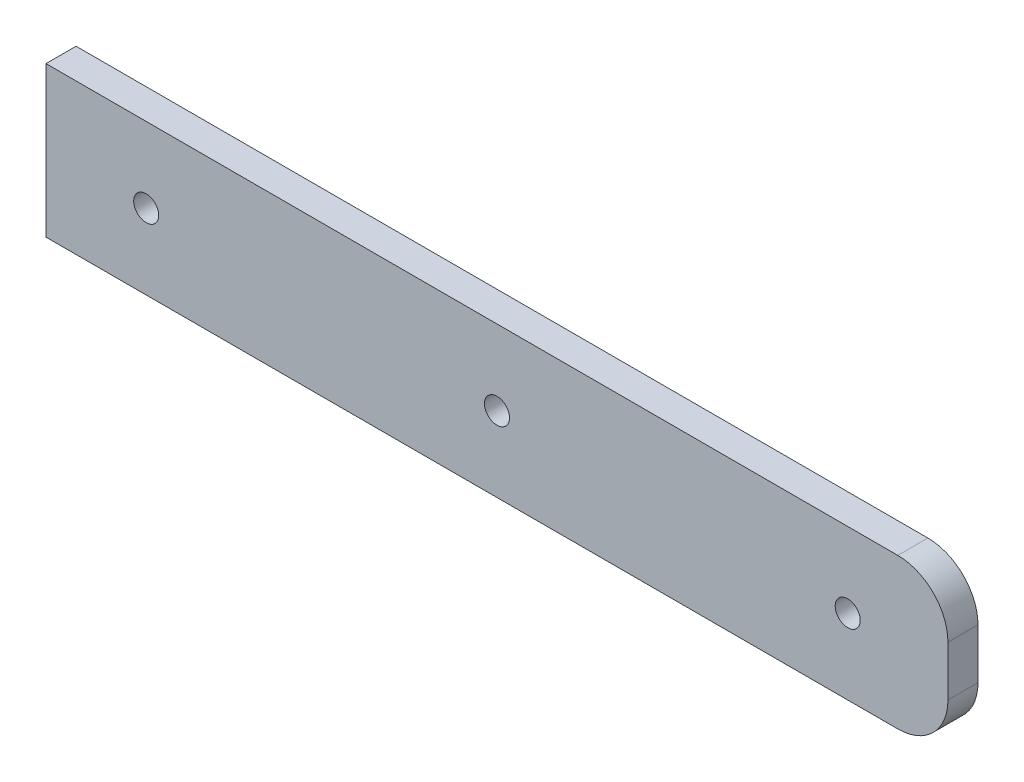
ISO-10303-21;
HEADER;
FILE_DESCRIPTION(('STEP AP214'),'2;1');
FILE_NAME('part.step','',(''),(''),'','','');
FILE_SCHEMA(('AUTOMOTIVE_DESIGN { 1 0 10303 214 1 1 1 1 }'));
ENDSEC;
DATA;
#1=APPLICATION_CONTEXT('core data for automotive mechanical design processes');
#2=APPLICATION_PROTOCOL_DEFINITION('international standard','automotive_design',2000,#1);
#3=PRODUCT_CONTEXT('',#1,'mechanical');
#4=PRODUCT('Part','Part','',(#3));
#5=PRODUCT_RELATED_PRODUCT_CATEGORY('part','',(#4));
#6=PRODUCT_DEFINITION_FORMATION('','',#4);
#7=PRODUCT_DEFINITION_CONTEXT('part definition',#1,'design');
#8=PRODUCT_DEFINITION('design','',#6,#7);
#9=PRODUCT_DEFINITION_SHAPE('','',#8);
#10=(LENGTH_UNIT() NAMED_UNIT(*) SI_UNIT(.MILLI.,.METRE.));
#11=(NAMED_UNIT(*) PLANE_ANGLE_UNIT() SI_UNIT($,.RADIAN.));
#12=(NAMED_UNIT(*) SI_UNIT($,.STERADIAN.) SOLID_ANGLE_UNIT());
#13=UNCERTAINTY_MEASURE_WITH_UNIT(LENGTH_MEASURE(1.E-05),#10,'distance_accuracy_value','');
#14=(GEOMETRIC_REPRESENTATION_CONTEXT(3) GLOBAL_UNCERTAINTY_ASSIGNED_CONTEXT((#13)) GLOBAL_UNIT_ASSIGNED_CONTEXT((#10,
#11,#12)) REPRESENTATION_CONTEXT('',''));
#15=CARTESIAN_POINT('',(0.,0.,0.));
#16=DIRECTION('',(0.,0.,1.));
#17=DIRECTION('',(1.,0.,0.));
#18=AXIS2_PLACEMENT_3D('',#15,#16,#17);
#19=CARTESIAN_POINT('',(202.677406728923,0.,6.));
#20=DIRECTION('',(1.,0.,0.));
#21=DIRECTION('',(0.,0.,-1.));
#22=AXIS2_PLACEMENT_3D('',#19,#20,#21);
#23=PLANE('',#22);
#24=DIRECTION('',(0.,-1.,0.));
#25=VECTOR('',#24,1.);
#26=CARTESIAN_POINT('',(202.677406728923,0.,6.));
#27=LINE('',#26,#25);
#28=CARTESIAN_POINT('',(202.677406728923,308.328575942871,6.));
#29=VERTEX_POINT('',#28);
#30=CARTESIAN_POINT('',(202.677406728923,298.328575942871,6.));
#31=VERTEX_POINT('',#30);
#32=EDGE_CURVE('E116',#29,#31,#27,.T.);
#33=ORIENTED_EDGE('',*,*,#32,.T.);
#34=DIRECTION('',(0.,0.,-1.));
#35=VECTOR('',#34,1.);
#36=CARTESIAN_POINT('',(202.677406728923,298.328575942871,0.));
#37=LINE('',#36,#35);
#38=CARTESIAN_POINT('',(202.677406728923,298.328575942871,0.));
#39=VERTEX_POINT('',#38);
#40=EDGE_CURVE('E163',#31,#39,#37,.T.);
#41=ORIENTED_EDGE('',*,*,#40,.T.);
#42=DIRECTION('',(0.,-1.,0.));
#43=VECTOR('',#42,1.);
#44=CARTESIAN_POINT('',(202.677406728923,0.,0.));
#45=LINE('',#44,#43);
#46=CARTESIAN_POINT('',(202.677406728923,308.328575942871,0.));
#47=VERTEX_POINT('',#46);
#48=EDGE_CURVE('E152',#47,#39,#45,.T.);
#49=ORIENTED_EDGE('',*,*,#48,.F.);
#50=DIRECTION('',(0.,0.,-1.));
#51=VECTOR('',#50,1.);
#52=CARTESIAN_POINT('',(202.677406728923,308.328575942871,6.));
#53=LINE('',#52,#51);
#54=EDGE_CURVE('E104',#47,#29,#53,.F.);
#55=ORIENTED_EDGE('',*,*,#54,.T.);
#56=EDGE_LOOP('',(#33,#41,#49,#55));
#57=FACE_BOUND('',#56,.T.);
#58=ADVANCED_FACE('F39',(#57),#23,.T.);
#59=CARTESIAN_POINT('',(0.,318.328575942871,6.));
#60=DIRECTION('',(0.,1.,0.));
#61=DIRECTION('',(0.,0.,1.));
#62=AXIS2_PLACEMENT_3D('',#59,#60,#61);
#63=PLANE('',#62);
#64=DIRECTION('',(1.,0.,0.));
#65=VECTOR('',#64,1.);
#66=CARTESIAN_POINT('',(0.,318.328575942871,6.));
#67=LINE('',#66,#65);
#68=CARTESIAN_POINT('',(22.6774067289232,318.328575942871,6.));
#69=VERTEX_POINT('',#68);
#70=CARTESIAN_POINT('',(192.677406728923,318.328575942871,6.));
#71=VERTEX_POINT('',#70);
#72=EDGE_CURVE('E97',#69,#71,#67,.T.);
#73=ORIENTED_EDGE('',*,*,#72,.T.);
#74=DIRECTION('',(0.,0.,-1.));
#75=VECTOR('',#74,1.);
#76=CARTESIAN_POINT('',(192.677406728923,318.328575942871,6.));
#77=LINE('',#76,#75);
#78=CARTESIAN_POINT('',(192.677406728923,318.328575942871,0.));
#79=VERTEX_POINT('',#78);
#80=EDGE_CURVE('E12',#71,#79,#77,.T.);
#81=ORIENTED_EDGE('',*,*,#80,.T.);
#82=DIRECTION('',(1.,0.,0.));
#83=VECTOR('',#82,1.);
#84=CARTESIAN_POINT('',(0.,318.328575942871,0.));
#85=LINE('',#84,#83);
#86=CARTESIAN_POINT('',(22.6774067289232,318.328575942871,0.));
#87=VERTEX_POINT('',#86);
#88=EDGE_CURVE('E100',#87,#79,#85,.T.);
#89=ORIENTED_EDGE('',*,*,#88,.F.);
#90=DIRECTION('',(0.,0.,-1.));
#91=VECTOR('',#90,1.);
#92=CARTESIAN_POINT('',(22.6774067289232,318.328575942871,6.));
#93=LINE('',#92,#91);
#94=EDGE_CURVE('E94',#69,#87,#93,.T.);
#95=ORIENTED_EDGE('',*,*,#94,.F.);
#96=EDGE_LOOP('',(#73,#81,#89,#95));
#97=FACE_BOUND('',#96,.T.);
#98=ADVANCED_FACE('F96',(#97),#63,.T.);
#99=CARTESIAN_POINT('',(22.6774067289233,0.,6.));
#100=DIRECTION('',(1.,0.,0.));
#101=DIRECTION('',(0.,1.,0.));
#102=AXIS2_PLACEMENT_3D('',#99,#100,#101);
#103=PLANE('',#102);
#104=DIRECTION('',(0.,-1.,0.));
#105=VECTOR('',#104,1.);
#106=CARTESIAN_POINT('',(22.6774067289233,0.,0.));
#107=LINE('',#106,#105);
#108=CARTESIAN_POINT('',(22.6774067289232,288.328575942871,0.));
#109=VERTEX_POINT('',#108);
#110=EDGE_CURVE('E156',#87,#109,#107,.T.);
#111=ORIENTED_EDGE('',*,*,#110,.T.);
#112=DIRECTION('',(0.,0.,-1.));
#113=VECTOR('',#112,1.);
#114=CARTESIAN_POINT('',(22.6774067289232,288.328575942871,6.));
#115=LINE('',#114,#113);
#116=CARTESIAN_POINT('',(22.6774067289232,288.328575942871,6.));
#117=VERTEX_POINT('',#116);
#118=EDGE_CURVE('E105',#117,#109,#115,.T.);
#119=ORIENTED_EDGE('',*,*,#118,.F.);
#120=DIRECTION('',(0.,-1.,0.));
#121=VECTOR('',#120,1.);
#122=CARTESIAN_POINT('',(22.6774067289233,0.,6.));
#123=LINE('',#122,#121);
#124=EDGE_CURVE('E109',#69,#117,#123,.T.);
#125=ORIENTED_EDGE('',*,*,#124,.F.);
#126=ORIENTED_EDGE('',*,*,#94,.T.);
#127=EDGE_LOOP('',(#111,#119,#125,#126));
#128=FACE_BOUND('',#127,.T.);
#129=ADVANCED_FACE('F110',(#128),#103,.F.);
#130=CARTESIAN_POINT('',(42.6774067289233,303.328575942871,6.));
#131=DIRECTION('',(0.,0.,-1.));
#132=DIRECTION('',(-1.,0.,0.));
#133=AXIS2_PLACEMENT_3D('',#130,#131,#132);
#134=CYLINDRICAL_SURFACE('',#133,2.5);
#135=CARTESIAN_POINT('',(42.6774067289233,303.328575942871,6.));
#136=DIRECTION('',(0.,0.,1.));
#137=DIRECTION('',(1.,0.,0.));
#138=AXIS2_PLACEMENT_3D('',#135,#136,#137);
#139=CIRCLE('',#138,2.5);
#140=CARTESIAN_POINT('',(45.1774067289233,303.328575942871,6.));
#141=VERTEX_POINT('',#140);
#142=EDGE_CURVE('E121',#141,#141,#139,.T.);
#143=ORIENTED_EDGE('',*,*,#142,.T.);
#144=EDGE_LOOP('',(#143));
#145=FACE_BOUND('',#144,.T.);
#146=CARTESIAN_POINT('',(42.6774067289233,303.328575942871,0.));
#147=DIRECTION('',(0.,0.,1.));
#148=DIRECTION('',(1.,0.,0.));
#149=AXIS2_PLACEMENT_3D('',#146,#147,#148);
#150=CIRCLE('',#149,2.5);
#151=CARTESIAN_POINT('',(45.1774067289233,303.328575942871,0.));
#152=VERTEX_POINT('',#151);
#153=EDGE_CURVE('E149',#152,#152,#150,.T.);
#154=ORIENTED_EDGE('',*,*,#153,.F.);
#155=EDGE_LOOP('',(#154));
#156=FACE_BOUND('',#155,.T.);
#157=ADVANCED_FACE('F191',(#145,#156),#134,.F.);
#158=CARTESIAN_POINT('',(112.677406728923,303.328575942871,6.));
#159=DIRECTION('',(0.,0.,-1.));
#160=DIRECTION('',(-1.,0.,0.));
#161=AXIS2_PLACEMENT_3D('',#158,#159,#160);
#162=CYLINDRICAL_SURFACE('',#161,2.5);
#163=CARTESIAN_POINT('',(112.677406728923,303.328575942871,6.));
#164=DIRECTION('',(0.,0.,1.));
#165=DIRECTION('',(1.,0.,0.));
#166=AXIS2_PLACEMENT_3D('',#163,#164,#165);
#167=CIRCLE('',#166,2.5);
#168=CARTESIAN_POINT('',(115.177406728923,303.328575942871,6.));
#169=VERTEX_POINT('',#168);
#170=EDGE_CURVE('E293',#169,#169,#167,.T.);
#171=ORIENTED_EDGE('',*,*,#170,.T.);
#172=EDGE_LOOP('',(#171));
#173=FACE_BOUND('',#172,.T.);
#174=CARTESIAN_POINT('',(112.677406728923,303.328575942871,0.));
#175=DIRECTION('',(0.,0.,1.));
#176=DIRECTION('',(1.,0.,0.));
#177=AXIS2_PLACEMENT_3D('',#174,#175,#176);
#178=CIRCLE('',#177,2.5);
#179=CARTESIAN_POINT('',(115.177406728923,303.328575942871,0.));
#180=VERTEX_POINT('',#179);
#181=EDGE_CURVE('E146',#180,#180,#178,.T.);
#182=ORIENTED_EDGE('',*,*,#181,.F.);
#183=EDGE_LOOP('',(#182));
#184=FACE_BOUND('',#183,.T.);
#185=ADVANCED_FACE('F194',(#173,#184),#162,.F.);
#186=CARTESIAN_POINT('',(182.677406728923,303.328575942871,6.));
#187=DIRECTION('',(0.,0.,-1.));
#188=DIRECTION('',(-1.,0.,0.));
#189=AXIS2_PLACEMENT_3D('',#186,#187,#188);
#190=CYLINDRICAL_SURFACE('',#189,2.5);
#191=CARTESIAN_POINT('',(182.677406728923,303.328575942871,6.));
#192=DIRECTION('',(0.,0.,1.));
#193=DIRECTION('',(1.,0.,0.));
#194=AXIS2_PLACEMENT_3D('',#191,#192,#193);
#195=CIRCLE('',#194,2.5);
#196=CARTESIAN_POINT('',(185.177406728923,303.328575942871,6.));
#197=VERTEX_POINT('',#196);
#198=EDGE_CURVE('E160',#197,#197,#195,.T.);
#199=ORIENTED_EDGE('',*,*,#198,.T.);
#200=EDGE_LOOP('',(#199));
#201=FACE_BOUND('',#200,.T.);
#202=CARTESIAN_POINT('',(182.677406728923,303.328575942871,0.));
#203=DIRECTION('',(0.,0.,1.));
#204=DIRECTION('',(1.,0.,0.));
#205=AXIS2_PLACEMENT_3D('',#202,#203,#204);
#206=CIRCLE('',#205,2.5);
#207=CARTESIAN_POINT('',(185.177406728923,303.328575942871,0.));
#208=VERTEX_POINT('',#207);
#209=EDGE_CURVE('E143',#208,#208,#206,.T.);
#210=ORIENTED_EDGE('',*,*,#209,.F.);
#211=EDGE_LOOP('',(#210));
#212=FACE_BOUND('',#211,.T.);
#213=ADVANCED_FACE('F198',(#201,#212),#190,.F.);
#214=CARTESIAN_POINT('',(0.,288.328575942871,6.));
#215=DIRECTION('',(0.,1.,0.));
#216=DIRECTION('',(0.,0.,1.));
#217=AXIS2_PLACEMENT_3D('',#214,#215,#216);
#218=PLANE('',#217);
#219=DIRECTION('',(1.,0.,0.));
#220=VECTOR('',#219,1.);
#221=CARTESIAN_POINT('',(0.,288.328575942871,0.));
#222=LINE('',#221,#220);
#223=CARTESIAN_POINT('',(192.677406728923,288.328575942871,0.));
#224=VERTEX_POINT('',#223);
#225=EDGE_CURVE('E158',#109,#224,#222,.T.);
#226=ORIENTED_EDGE('',*,*,#225,.T.);
#227=DIRECTION('',(0.,0.,-1.));
#228=VECTOR('',#227,1.);
#229=CARTESIAN_POINT('',(192.677406728923,288.328575942871,6.));
#230=LINE('',#229,#228);
#231=CARTESIAN_POINT('',(192.677406728923,288.328575942871,6.));
#232=VERTEX_POINT('',#231);
#233=EDGE_CURVE('E62',#224,#232,#230,.F.);
#234=ORIENTED_EDGE('',*,*,#233,.T.);
#235=DIRECTION('',(1.,0.,0.));
#236=VECTOR('',#235,1.);
#237=CARTESIAN_POINT('',(0.,288.328575942871,6.));
#238=LINE('',#237,#236);
#239=EDGE_CURVE('E113',#117,#232,#238,.T.);
#240=ORIENTED_EDGE('',*,*,#239,.F.);
#241=ORIENTED_EDGE('',*,*,#118,.T.);
#242=EDGE_LOOP('',(#226,#234,#240,#241));
#243=FACE_BOUND('',#242,.T.);
#244=ADVANCED_FACE('F173',(#243),#218,.F.);
#245=CARTESIAN_POINT('',(0.,0.,6.));
#246=DIRECTION('',(0.,0.,1.));
#247=DIRECTION('',(1.,0.,0.));
#248=AXIS2_PLACEMENT_3D('',#245,#246,#247);
#249=PLANE('',#248);
#250=ORIENTED_EDGE('',*,*,#198,.F.);
#251=EDGE_LOOP('',(#250));
#252=FACE_BOUND('',#251,.T.);
#253=ORIENTED_EDGE('',*,*,#170,.F.);
#254=EDGE_LOOP('',(#253));
#255=FACE_BOUND('',#254,.T.);
#256=ORIENTED_EDGE('',*,*,#142,.F.);
#257=EDGE_LOOP('',(#256));
#258=FACE_BOUND('',#257,.T.);
#259=ORIENTED_EDGE('',*,*,#239,.T.);
#260=CARTESIAN_POINT('',(192.677406728923,298.328575942871,6.));
#261=DIRECTION('',(0.,0.,1.));
#262=DIRECTION('',(1.,0.,0.));
#263=AXIS2_PLACEMENT_3D('',#260,#261,#262);
#264=CIRCLE('',#263,10.);
#265=EDGE_CURVE('E47',#232,#31,#264,.T.);
#266=ORIENTED_EDGE('',*,*,#265,.T.);
#267=ORIENTED_EDGE('',*,*,#32,.F.);
#268=CARTESIAN_POINT('',(192.677406728923,308.328575942871,6.));
#269=DIRECTION('',(0.,0.,1.));
#270=DIRECTION('',(1.,0.,0.));
#271=AXIS2_PLACEMENT_3D('',#268,#269,#270);
#272=CIRCLE('',#271,10.);
#273=EDGE_CURVE('E54',#29,#71,#272,.T.);
#274=ORIENTED_EDGE('',*,*,#273,.T.);
#275=ORIENTED_EDGE('',*,*,#72,.F.);
#276=ORIENTED_EDGE('',*,*,#124,.T.);
#277=EDGE_LOOP('',(#259,#266,#267,#274,#275,#276));
#278=FACE_BOUND('',#277,.T.);
#279=ADVANCED_FACE('F114',(#252,#255,#258,#278),#249,.T.);
#280=CARTESIAN_POINT('',(0.,0.,0.));
#281=DIRECTION('',(0.,0.,1.));
#282=DIRECTION('',(1.,0.,0.));
#283=AXIS2_PLACEMENT_3D('',#280,#281,#282);
#284=PLANE('',#283);
#285=ORIENTED_EDGE('',*,*,#209,.T.);
#286=EDGE_LOOP('',(#285));
#287=FACE_BOUND('',#286,.T.);
#288=ORIENTED_EDGE('',*,*,#181,.T.);
#289=EDGE_LOOP('',(#288));
#290=FACE_BOUND('',#289,.T.);
#291=ORIENTED_EDGE('',*,*,#153,.T.);
#292=EDGE_LOOP('',(#291));
#293=FACE_BOUND('',#292,.T.);
#294=ORIENTED_EDGE('',*,*,#48,.T.);
#295=CARTESIAN_POINT('',(192.677406728923,298.328575942871,0.));
#296=DIRECTION('',(0.,0.,1.));
#297=DIRECTION('',(1.,0.,0.));
#298=AXIS2_PLACEMENT_3D('',#295,#296,#297);
#299=CIRCLE('',#298,10.);
#300=EDGE_CURVE('E167',#39,#224,#299,.F.);
#301=ORIENTED_EDGE('',*,*,#300,.T.);
#302=ORIENTED_EDGE('',*,*,#225,.F.);
#303=ORIENTED_EDGE('',*,*,#110,.F.);
#304=ORIENTED_EDGE('',*,*,#88,.T.);
#305=CARTESIAN_POINT('',(192.677406728923,308.328575942871,0.));
#306=DIRECTION('',(0.,0.,1.));
#307=DIRECTION('',(1.,0.,0.));
#308=AXIS2_PLACEMENT_3D('',#305,#306,#307);
#309=CIRCLE('',#308,10.);
#310=EDGE_CURVE('E166',#79,#47,#309,.F.);
#311=ORIENTED_EDGE('',*,*,#310,.T.);
#312=EDGE_LOOP('',(#294,#301,#302,#303,#304,#311));
#313=FACE_BOUND('',#312,.T.);
#314=ADVANCED_FACE('F169',(#287,#290,#293,#313),#284,.F.);
#315=CARTESIAN_POINT('',(192.677406728923,298.328575942871,6.));
#316=DIRECTION('',(0.,0.,1.));
#317=DIRECTION('',(1.,0.,0.));
#318=AXIS2_PLACEMENT_3D('',#315,#316,#317);
#319=CYLINDRICAL_SURFACE('',#318,10.);
#320=ORIENTED_EDGE('',*,*,#265,.F.);
#321=ORIENTED_EDGE('',*,*,#233,.F.);
#322=ORIENTED_EDGE('',*,*,#300,.F.);
#323=ORIENTED_EDGE('',*,*,#40,.F.);
#324=EDGE_LOOP('',(#320,#321,#322,#323));
#325=FACE_BOUND('',#324,.T.);
#326=ADVANCED_FACE('F175',(#325),#319,.T.);
#327=CARTESIAN_POINT('',(192.677406728923,308.328575942871,6.));
#328=DIRECTION('',(0.,0.,-1.));
#329=DIRECTION('',(-1.,0.,0.));
#330=AXIS2_PLACEMENT_3D('',#327,#328,#329);
#331=CYLINDRICAL_SURFACE('',#330,10.);
#332=ORIENTED_EDGE('',*,*,#273,.F.);
#333=ORIENTED_EDGE('',*,*,#54,.F.);
#334=ORIENTED_EDGE('',*,*,#310,.F.);
#335=ORIENTED_EDGE('',*,*,#80,.F.);
#336=EDGE_LOOP('',(#332,#333,#334,#335));
#337=FACE_BOUND('',#336,.T.);
#338=ADVANCED_FACE('F41',(#337),#331,.T.);
#339=CLOSED_SHELL('',(#58,#98,#129,#157,#185,#213,#244,#279,#314,#326,#338));
#340=MANIFOLD_SOLID_BREP('B2',#339);
#341=ADVANCED_BREP_SHAPE_REPRESENTATION('',(#18,#340),#14);
#342=SHAPE_DEFINITION_REPRESENTATION(#9,#341);
ENDSEC;
END-ISO-10303-21;
